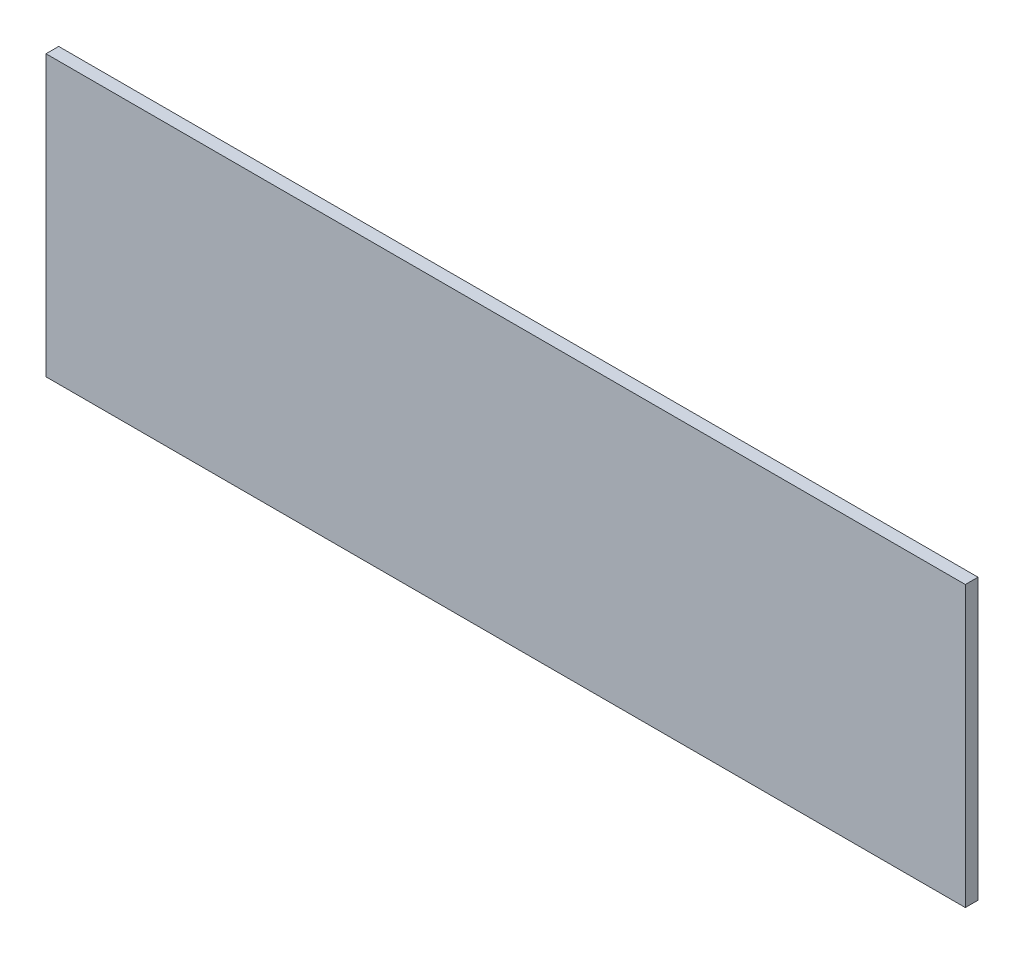
ISO-10303-21;
HEADER;
FILE_DESCRIPTION(('STEP AP214'),'2;1');
FILE_NAME('part.step','',(''),(''),'','','');
FILE_SCHEMA(('AUTOMOTIVE_DESIGN { 1 0 10303 214 1 1 1 1 }'));
ENDSEC;
DATA;
#1=APPLICATION_CONTEXT('core data for automotive mechanical design processes');
#2=APPLICATION_PROTOCOL_DEFINITION('international standard','automotive_design',2000,#1);
#3=PRODUCT_CONTEXT('',#1,'mechanical');
#4=PRODUCT('Part','Part','',(#3));
#5=PRODUCT_RELATED_PRODUCT_CATEGORY('part','',(#4));
#6=PRODUCT_DEFINITION_FORMATION('','',#4);
#7=PRODUCT_DEFINITION_CONTEXT('part definition',#1,'design');
#8=PRODUCT_DEFINITION('design','',#6,#7);
#9=PRODUCT_DEFINITION_SHAPE('','',#8);
#10=(LENGTH_UNIT() NAMED_UNIT(*) SI_UNIT(.MILLI.,.METRE.));
#11=(NAMED_UNIT(*) PLANE_ANGLE_UNIT() SI_UNIT($,.RADIAN.));
#12=(NAMED_UNIT(*) SI_UNIT($,.STERADIAN.) SOLID_ANGLE_UNIT());
#13=UNCERTAINTY_MEASURE_WITH_UNIT(LENGTH_MEASURE(1.E-05),#10,'distance_accuracy_value','');
#14=(GEOMETRIC_REPRESENTATION_CONTEXT(3) GLOBAL_UNCERTAINTY_ASSIGNED_CONTEXT((#13)) GLOBAL_UNIT_ASSIGNED_CONTEXT((#10,
#11,#12)) REPRESENTATION_CONTEXT('',''));
#15=CARTESIAN_POINT('',(0.,0.,0.));
#16=DIRECTION('',(0.,0.,1.));
#17=DIRECTION('',(1.,0.,0.));
#18=AXIS2_PLACEMENT_3D('',#15,#16,#17);
#19=CARTESIAN_POINT('',(230.,-70.,6.35));
#20=DIRECTION('',(-1.,0.,0.));
#21=DIRECTION('',(0.,0.,1.));
#22=AXIS2_PLACEMENT_3D('',#19,#20,#21);
#23=PLANE('',#22);
#24=DIRECTION('',(0.,1.,0.));
#25=VECTOR('',#24,1.);
#26=CARTESIAN_POINT('',(230.,-70.,0.));
#27=LINE('',#26,#25);
#28=CARTESIAN_POINT('',(230.,-70.,0.));
#29=VERTEX_POINT('',#28);
#30=CARTESIAN_POINT('',(230.,70.,0.));
#31=VERTEX_POINT('',#30);
#32=EDGE_CURVE('E95',#29,#31,#27,.T.);
#33=ORIENTED_EDGE('',*,*,#32,.T.);
#34=DIRECTION('',(0.,0.,-1.));
#35=VECTOR('',#34,1.);
#36=CARTESIAN_POINT('',(230.,70.,6.35));
#37=LINE('',#36,#35);
#38=CARTESIAN_POINT('',(230.,70.,6.35));
#39=VERTEX_POINT('',#38);
#40=EDGE_CURVE('E11',#39,#31,#37,.T.);
#41=ORIENTED_EDGE('',*,*,#40,.F.);
#42=DIRECTION('',(0.,1.,0.));
#43=VECTOR('',#42,1.);
#44=CARTESIAN_POINT('',(230.,-70.,6.35));
#45=LINE('',#44,#43);
#46=CARTESIAN_POINT('',(230.,-70.,6.35));
#47=VERTEX_POINT('',#46);
#48=EDGE_CURVE('E83',#47,#39,#45,.T.);
#49=ORIENTED_EDGE('',*,*,#48,.F.);
#50=DIRECTION('',(0.,0.,-1.));
#51=VECTOR('',#50,1.);
#52=CARTESIAN_POINT('',(230.,-70.,6.35));
#53=LINE('',#52,#51);
#54=EDGE_CURVE('E91',#47,#29,#53,.T.);
#55=ORIENTED_EDGE('',*,*,#54,.T.);
#56=EDGE_LOOP('',(#33,#41,#49,#55));
#57=FACE_BOUND('',#56,.T.);
#58=ADVANCED_FACE('F32',(#57),#23,.F.);
#59=CARTESIAN_POINT('',(-230.,70.,6.35));
#60=DIRECTION('',(0.,-1.,0.));
#61=DIRECTION('',(0.,0.,-1.));
#62=AXIS2_PLACEMENT_3D('',#59,#60,#61);
#63=PLANE('',#62);
#64=DIRECTION('',(-1.,0.,0.));
#65=VECTOR('',#64,1.);
#66=CARTESIAN_POINT('',(-230.,70.,0.));
#67=LINE('',#66,#65);
#68=CARTESIAN_POINT('',(-230.,70.,0.));
#69=VERTEX_POINT('',#68);
#70=EDGE_CURVE('E87',#31,#69,#67,.T.);
#71=ORIENTED_EDGE('',*,*,#70,.T.);
#72=DIRECTION('',(0.,0.,-1.));
#73=VECTOR('',#72,1.);
#74=CARTESIAN_POINT('',(-230.,70.,6.35));
#75=LINE('',#74,#73);
#76=CARTESIAN_POINT('',(-230.,70.,6.35));
#77=VERTEX_POINT('',#76);
#78=EDGE_CURVE('E40',#77,#69,#75,.T.);
#79=ORIENTED_EDGE('',*,*,#78,.F.);
#80=DIRECTION('',(-1.,0.,0.));
#81=VECTOR('',#80,1.);
#82=CARTESIAN_POINT('',(-230.,70.,6.35));
#83=LINE('',#82,#81);
#84=EDGE_CURVE('E78',#39,#77,#83,.T.);
#85=ORIENTED_EDGE('',*,*,#84,.F.);
#86=ORIENTED_EDGE('',*,*,#40,.T.);
#87=EDGE_LOOP('',(#71,#79,#85,#86));
#88=FACE_BOUND('',#87,.T.);
#89=ADVANCED_FACE('F86',(#88),#63,.F.);
#90=CARTESIAN_POINT('',(-230.,-70.,6.35));
#91=DIRECTION('',(1.,0.,0.));
#92=DIRECTION('',(0.,0.,-1.));
#93=AXIS2_PLACEMENT_3D('',#90,#91,#92);
#94=PLANE('',#93);
#95=DIRECTION('',(0.,-1.,0.));
#96=VECTOR('',#95,1.);
#97=CARTESIAN_POINT('',(-230.,-70.,0.));
#98=LINE('',#97,#96);
#99=CARTESIAN_POINT('',(-230.,-70.,0.));
#100=VERTEX_POINT('',#99);
#101=EDGE_CURVE('E65',#69,#100,#98,.T.);
#102=ORIENTED_EDGE('',*,*,#101,.T.);
#103=DIRECTION('',(0.,0.,-1.));
#104=VECTOR('',#103,1.);
#105=CARTESIAN_POINT('',(-230.,-70.,6.35));
#106=LINE('',#105,#104);
#107=CARTESIAN_POINT('',(-230.,-70.,6.35));
#108=VERTEX_POINT('',#107);
#109=EDGE_CURVE('E88',#108,#100,#106,.T.);
#110=ORIENTED_EDGE('',*,*,#109,.F.);
#111=DIRECTION('',(0.,-1.,0.));
#112=VECTOR('',#111,1.);
#113=CARTESIAN_POINT('',(-230.,-70.,6.35));
#114=LINE('',#113,#112);
#115=EDGE_CURVE('E81',#77,#108,#114,.T.);
#116=ORIENTED_EDGE('',*,*,#115,.F.);
#117=ORIENTED_EDGE('',*,*,#78,.T.);
#118=EDGE_LOOP('',(#102,#110,#116,#117));
#119=FACE_BOUND('',#118,.T.);
#120=ADVANCED_FACE('F89',(#119),#94,.F.);
#121=CARTESIAN_POINT('',(-230.,-70.,6.35));
#122=DIRECTION('',(0.,1.,0.));
#123=DIRECTION('',(0.,0.,1.));
#124=AXIS2_PLACEMENT_3D('',#121,#122,#123);
#125=PLANE('',#124);
#126=DIRECTION('',(1.,0.,0.));
#127=VECTOR('',#126,1.);
#128=CARTESIAN_POINT('',(-230.,-70.,0.));
#129=LINE('',#128,#127);
#130=EDGE_CURVE('E71',#100,#29,#129,.T.);
#131=ORIENTED_EDGE('',*,*,#130,.T.);
#132=ORIENTED_EDGE('',*,*,#54,.F.);
#133=DIRECTION('',(1.,0.,0.));
#134=VECTOR('',#133,1.);
#135=CARTESIAN_POINT('',(-230.,-70.,6.35));
#136=LINE('',#135,#134);
#137=EDGE_CURVE('E48',#108,#47,#136,.T.);
#138=ORIENTED_EDGE('',*,*,#137,.F.);
#139=ORIENTED_EDGE('',*,*,#109,.T.);
#140=EDGE_LOOP('',(#131,#132,#138,#139));
#141=FACE_BOUND('',#140,.T.);
#142=ADVANCED_FACE('F102',(#141),#125,.F.);
#143=CARTESIAN_POINT('',(0.,0.,6.35));
#144=DIRECTION('',(0.,0.,-1.));
#145=DIRECTION('',(-1.,0.,0.));
#146=AXIS2_PLACEMENT_3D('',#143,#144,#145);
#147=PLANE('',#146);
#148=ORIENTED_EDGE('',*,*,#48,.T.);
#149=ORIENTED_EDGE('',*,*,#84,.T.);
#150=ORIENTED_EDGE('',*,*,#115,.T.);
#151=ORIENTED_EDGE('',*,*,#137,.T.);
#152=EDGE_LOOP('',(#148,#149,#150,#151));
#153=FACE_BOUND('',#152,.T.);
#154=ADVANCED_FACE('F79',(#153),#147,.F.);
#155=CARTESIAN_POINT('',(0.,0.,0.));
#156=DIRECTION('',(0.,0.,-1.));
#157=DIRECTION('',(-1.,0.,0.));
#158=AXIS2_PLACEMENT_3D('',#155,#156,#157);
#159=PLANE('',#158);
#160=ORIENTED_EDGE('',*,*,#32,.F.);
#161=ORIENTED_EDGE('',*,*,#130,.F.);
#162=ORIENTED_EDGE('',*,*,#101,.F.);
#163=ORIENTED_EDGE('',*,*,#70,.F.);
#164=EDGE_LOOP('',(#160,#161,#162,#163));
#165=FACE_BOUND('',#164,.T.);
#166=ADVANCED_FACE('F105',(#165),#159,.T.);
#167=CLOSED_SHELL('',(#58,#89,#120,#142,#154,#166));
#168=MANIFOLD_SOLID_BREP('B2',#167);
#169=ADVANCED_BREP_SHAPE_REPRESENTATION('',(#18,#168),#14);
#170=SHAPE_DEFINITION_REPRESENTATION(#9,#169);
ENDSEC;
END-ISO-10303-21;
